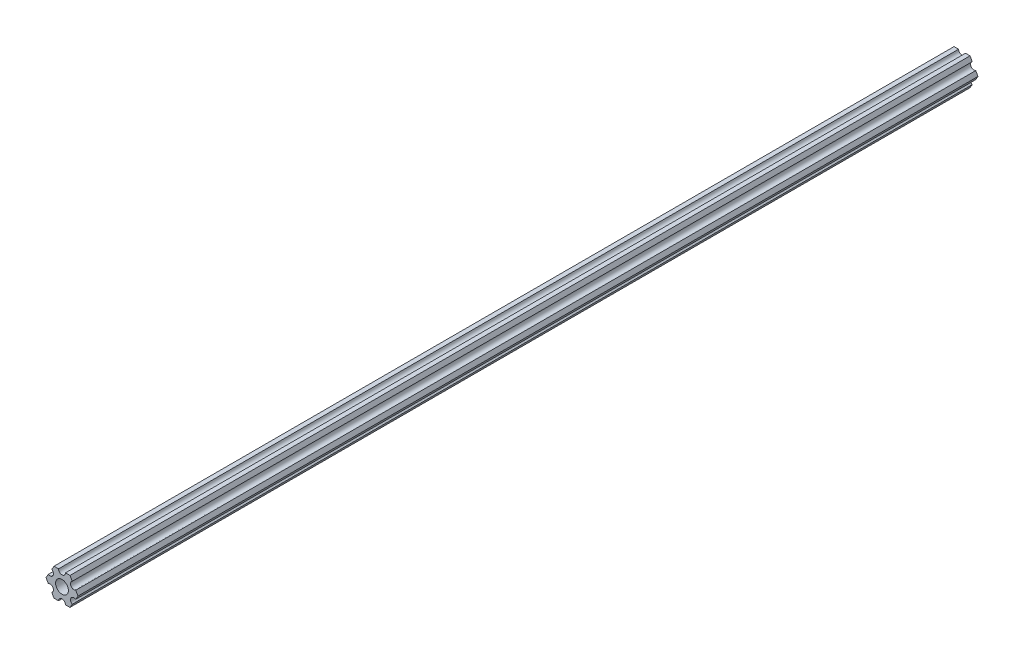
ISO-10303-21;
HEADER;
FILE_DESCRIPTION(('STEP AP214'),'2;1');
FILE_NAME('part.step','',(''),(''),'','','');
FILE_SCHEMA(('AUTOMOTIVE_DESIGN { 1 0 10303 214 1 1 1 1 }'));
ENDSEC;
DATA;
#1=APPLICATION_CONTEXT('core data for automotive mechanical design processes');
#2=APPLICATION_PROTOCOL_DEFINITION('international standard','automotive_design',2000,#1);
#3=PRODUCT_CONTEXT('',#1,'mechanical');
#4=PRODUCT('Part','Part','',(#3));
#5=PRODUCT_RELATED_PRODUCT_CATEGORY('part','',(#4));
#6=PRODUCT_DEFINITION_FORMATION('','',#4);
#7=PRODUCT_DEFINITION_CONTEXT('part definition',#1,'design');
#8=PRODUCT_DEFINITION('design','',#6,#7);
#9=PRODUCT_DEFINITION_SHAPE('','',#8);
#10=(LENGTH_UNIT() NAMED_UNIT(*) SI_UNIT(.MILLI.,.METRE.));
#11=(NAMED_UNIT(*) PLANE_ANGLE_UNIT() SI_UNIT($,.RADIAN.));
#12=(NAMED_UNIT(*) SI_UNIT($,.STERADIAN.) SOLID_ANGLE_UNIT());
#13=UNCERTAINTY_MEASURE_WITH_UNIT(LENGTH_MEASURE(1.E-05),#10,'distance_accuracy_value','');
#14=(GEOMETRIC_REPRESENTATION_CONTEXT(3) GLOBAL_UNCERTAINTY_ASSIGNED_CONTEXT((#13)) GLOBAL_UNIT_ASSIGNED_CONTEXT((#10,
#11,#12)) REPRESENTATION_CONTEXT('',''));
#15=CARTESIAN_POINT('',(0.,0.,0.));
#16=DIRECTION('',(0.,0.,1.));
#17=DIRECTION('',(1.,0.,0.));
#18=AXIS2_PLACEMENT_3D('',#15,#16,#17);
#19=CARTESIAN_POINT('',(5.49926112168156,3.17500033315933,412.75));
#20=DIRECTION('',(0.,0.,1.));
#21=DIRECTION('',(1.,0.,0.));
#22=AXIS2_PLACEMENT_3D('',#19,#20,#21);
#23=PLANE('',#22);
#24=DIRECTION('',(0.499999947533953,0.866025434075723,0.));
#25=VECTOR('',#24,1.);
#26=CARTESIAN_POINT('',(6.29301142309098,-1.80018429024546,412.75));
#27=LINE('',#26,#25);
#28=CARTESIAN_POINT('',(6.29301142309098,-1.80018429024546,412.75));
#29=VERTEX_POINT('',#28);
#30=CARTESIAN_POINT('',(7.33234841870826,4.44212519169686E-07,412.75));
#31=VERTEX_POINT('',#30);
#32=EDGE_CURVE('E228',#29,#31,#27,.T.);
#33=ORIENTED_EDGE('',*,*,#32,.T.);
#34=DIRECTION('',(-0.500000052466056,0.866025373493145,0.));
#35=VECTOR('',#34,1.);
#36=CARTESIAN_POINT('',(7.33234841870826,4.44212519169686E-07,412.75));
#37=LINE('',#36,#35);
#38=CARTESIAN_POINT('',(6.29301120497139,1.80018505273894,412.75));
#39=VERTEX_POINT('',#38);
#40=EDGE_CURVE('E126',#31,#39,#37,.T.);
#41=ORIENTED_EDGE('',*,*,#40,.T.);
#42=CARTESIAN_POINT('',(5.49926112168156,3.17500033315933,412.75));
#43=DIRECTION('',(0.,0.,-1.));
#44=DIRECTION('',(1.,0.,0.));
#45=AXIS2_PLACEMENT_3D('',#42,#43,#44);
#46=CIRCLE('',#45,1.5875);
#47=CARTESIAN_POINT('',(4.70551103839172,4.54981561357972,412.75));
#48=VERTEX_POINT('',#47);
#49=EDGE_CURVE('E273',#39,#48,#46,.T.);
#50=ORIENTED_EDGE('',*,*,#49,.T.);
#51=DIRECTION('',(-0.500000052466046,0.866025373493151,0.));
#52=VECTOR('',#51,1.);
#53=CARTESIAN_POINT('',(4.70551103839172,4.54981561357972,412.75));
#54=LINE('',#53,#52);
#55=CARTESIAN_POINT('',(3.66617382465481,6.35000022210627,412.75));
#56=VERTEX_POINT('',#55);
#57=EDGE_CURVE('E292',#48,#56,#54,.T.);
#58=ORIENTED_EDGE('',*,*,#57,.T.);
#59=DIRECTION('',(-0.999999999999998,-6.05825850611185E-08,0.));
#60=VECTOR('',#59,1.);
#61=CARTESIAN_POINT('',(3.66617382465481,6.35000022210627,412.75));
#62=LINE('',#61,#60);
#63=CARTESIAN_POINT('',(1.58749961530074,6.35000009617482,412.75));
#64=VERTEX_POINT('',#63);
#65=EDGE_CURVE('E289',#56,#64,#62,.T.);
#66=ORIENTED_EDGE('',*,*,#65,.T.);
#67=CARTESIAN_POINT('',(-3.84699260060323E-07,6.35,412.75));
#68=DIRECTION('',(0.,0.,-1.));
#69=DIRECTION('',(1.,0.,0.));
#70=AXIS2_PLACEMENT_3D('',#67,#68,#69);
#71=CIRCLE('',#70,1.5875);
#72=CARTESIAN_POINT('',(-1.58750038469926,6.34999990382518,412.75));
#73=VERTEX_POINT('',#72);
#74=EDGE_CURVE('E291',#64,#73,#71,.T.);
#75=ORIENTED_EDGE('',*,*,#74,.T.);
#76=DIRECTION('',(-0.999999999999998,-6.05825963273174E-08,0.));
#77=VECTOR('',#76,1.);
#78=CARTESIAN_POINT('',(-1.58750038469926,6.34999990382518,412.75));
#79=LINE('',#78,#77);
#80=CARTESIAN_POINT('',(-3.66617459405349,6.3499997778937,412.75));
#81=VERTEX_POINT('',#80);
#82=EDGE_CURVE('E294',#73,#81,#79,.T.);
#83=ORIENTED_EDGE('',*,*,#82,.T.);
#84=DIRECTION('',(-0.499999947533942,-0.866025434075729,0.));
#85=VECTOR('',#84,1.);
#86=CARTESIAN_POINT('',(-3.66617459405349,6.3499997778937,412.75));
#87=LINE('',#86,#85);
#88=CARTESIAN_POINT('',(-4.70551158967065,4.54981504343587,412.75));
#89=VERTEX_POINT('',#88);
#90=EDGE_CURVE('E300',#81,#89,#87,.T.);
#91=ORIENTED_EDGE('',*,*,#90,.T.);
#92=CARTESIAN_POINT('',(-5.49926150638082,3.17499966684067,412.75));
#93=DIRECTION('',(0.,0.,-1.));
#94=DIRECTION('',(1.,0.,0.));
#95=AXIS2_PLACEMENT_3D('',#92,#93,#94);
#96=CIRCLE('',#95,1.5875);
#97=CARTESIAN_POINT('',(-6.29301142309098,1.80018429024547,412.75));
#98=VERTEX_POINT('',#97);
#99=EDGE_CURVE('E302',#89,#98,#96,.T.);
#100=ORIENTED_EDGE('',*,*,#99,.T.);
#101=DIRECTION('',(-0.499999947533951,-0.866025434075724,0.));
#102=VECTOR('',#101,1.);
#103=CARTESIAN_POINT('',(-6.29301142309098,1.80018429024547,412.75));
#104=LINE('',#103,#102);
#105=CARTESIAN_POINT('',(-7.33234841870826,-4.44212523790841E-07,412.75));
#106=VERTEX_POINT('',#105);
#107=EDGE_CURVE('E304',#98,#106,#104,.T.);
#108=ORIENTED_EDGE('',*,*,#107,.T.);
#109=DIRECTION('',(0.500000052466045,-0.866025373493151,0.));
#110=VECTOR('',#109,1.);
#111=CARTESIAN_POINT('',(-7.33234841870826,-4.44212523790841E-07,412.75));
#112=LINE('',#111,#110);
#113=CARTESIAN_POINT('',(-6.29301120497141,-1.80018505273897,412.75));
#114=VERTEX_POINT('',#113);
#115=EDGE_CURVE('E306',#106,#114,#112,.T.);
#116=ORIENTED_EDGE('',*,*,#115,.T.);
#117=CARTESIAN_POINT('',(-5.49926112168156,-3.17500033315934,412.75));
#118=DIRECTION('',(0.,0.,-1.));
#119=DIRECTION('',(1.,0.,0.));
#120=AXIS2_PLACEMENT_3D('',#117,#118,#119);
#121=CIRCLE('',#120,1.5875);
#122=CARTESIAN_POINT('',(-4.70551103839172,-4.54981561357972,412.75));
#123=VERTEX_POINT('',#122);
#124=EDGE_CURVE('E308',#114,#123,#121,.T.);
#125=ORIENTED_EDGE('',*,*,#124,.T.);
#126=DIRECTION('',(0.500000052466045,-0.866025373493151,0.));
#127=VECTOR('',#126,1.);
#128=CARTESIAN_POINT('',(-4.70551103839172,-4.54981561357972,412.75));
#129=LINE('',#128,#127);
#130=CARTESIAN_POINT('',(-3.66617382465481,-6.35000022210628,412.75));
#131=VERTEX_POINT('',#130);
#132=EDGE_CURVE('E310',#123,#131,#129,.T.);
#133=ORIENTED_EDGE('',*,*,#132,.T.);
#134=DIRECTION('',(0.999999999999998,6.05825854783851E-08,0.));
#135=VECTOR('',#134,1.);
#136=CARTESIAN_POINT('',(-3.66617382465481,-6.35000022210628,412.75));
#137=LINE('',#136,#135);
#138=CARTESIAN_POINT('',(-1.58749961530074,-6.35000009617482,412.75));
#139=VERTEX_POINT('',#138);
#140=EDGE_CURVE('E312',#131,#139,#137,.T.);
#141=ORIENTED_EDGE('',*,*,#140,.T.);
#142=CARTESIAN_POINT('',(3.8469926204343E-07,-6.35,412.75));
#143=DIRECTION('',(0.,0.,-1.));
#144=DIRECTION('',(1.,0.,0.));
#145=AXIS2_PLACEMENT_3D('',#142,#143,#144);
#146=CIRCLE('',#145,1.5875);
#147=CARTESIAN_POINT('',(1.58750038469926,-6.34999990382518,412.75));
#148=VERTEX_POINT('',#147);
#149=EDGE_CURVE('E175',#139,#148,#146,.T.);
#150=ORIENTED_EDGE('',*,*,#149,.T.);
#151=DIRECTION('',(0.999999999999998,6.05825721258438E-08,0.));
#152=VECTOR('',#151,1.);
#153=CARTESIAN_POINT('',(1.58750038469926,-6.34999990382518,412.75));
#154=LINE('',#153,#152);
#155=CARTESIAN_POINT('',(3.66617459405346,-6.34999977789375,412.75));
#156=VERTEX_POINT('',#155);
#157=EDGE_CURVE('E169',#148,#156,#154,.T.);
#158=ORIENTED_EDGE('',*,*,#157,.T.);
#159=DIRECTION('',(0.499999947533941,0.86602543407573,0.));
#160=VECTOR('',#159,1.);
#161=CARTESIAN_POINT('',(3.66617459405346,-6.34999977789375,412.75));
#162=LINE('',#161,#160);
#163=CARTESIAN_POINT('',(4.70551158967065,-4.54981504343587,412.75));
#164=VERTEX_POINT('',#163);
#165=EDGE_CURVE('E173',#156,#164,#162,.T.);
#166=ORIENTED_EDGE('',*,*,#165,.T.);
#167=CARTESIAN_POINT('',(5.49926150638082,-3.17499966684067,412.75));
#168=DIRECTION('',(0.,0.,-1.));
#169=DIRECTION('',(1.,0.,0.));
#170=AXIS2_PLACEMENT_3D('',#167,#168,#169);
#171=CIRCLE('',#170,1.58750000000001);
#172=EDGE_CURVE('E53',#164,#29,#171,.T.);
#173=ORIENTED_EDGE('',*,*,#172,.T.);
#174=EDGE_LOOP('',(#33,#41,#50,#58,#66,#75,#83,#91,#100,#108,#116,#125,#133,#141,#150,#158,#166,#173));
#175=FACE_BOUND('',#174,.T.);
#176=CARTESIAN_POINT('',(0.,0.,412.75));
#177=DIRECTION('',(0.,0.,1.));
#178=DIRECTION('',(1.,0.,0.));
#179=AXIS2_PLACEMENT_3D('',#176,#177,#178);
#180=CIRCLE('',#179,2.9337);
#181=CARTESIAN_POINT('',(2.9337,0.,412.75));
#182=VERTEX_POINT('',#181);
#183=EDGE_CURVE('E197',#182,#182,#180,.T.);
#184=ORIENTED_EDGE('',*,*,#183,.F.);
#185=EDGE_LOOP('',(#184));
#186=FACE_BOUND('',#185,.T.);
#187=ADVANCED_FACE('F36',(#175,#186),#23,.T.);
#188=CARTESIAN_POINT('',(5.49926112168156,3.17500033315933,0.));
#189=DIRECTION('',(0.,0.,1.));
#190=DIRECTION('',(1.,0.,0.));
#191=AXIS2_PLACEMENT_3D('',#188,#189,#190);
#192=PLANE('',#191);
#193=DIRECTION('',(0.499999947533953,0.866025434075723,0.));
#194=VECTOR('',#193,1.);
#195=CARTESIAN_POINT('',(6.29301142309098,-1.80018429024546,0.));
#196=LINE('',#195,#194);
#197=CARTESIAN_POINT('',(6.29301142309098,-1.80018429024546,0.));
#198=VERTEX_POINT('',#197);
#199=CARTESIAN_POINT('',(7.33234841870826,4.44212519169686E-07,0.));
#200=VERTEX_POINT('',#199);
#201=EDGE_CURVE('E193',#198,#200,#196,.T.);
#202=ORIENTED_EDGE('',*,*,#201,.F.);
#203=CARTESIAN_POINT('',(5.49926150638082,-3.17499966684067,0.));
#204=DIRECTION('',(0.,0.,-1.));
#205=DIRECTION('',(1.,0.,0.));
#206=AXIS2_PLACEMENT_3D('',#203,#204,#205);
#207=CIRCLE('',#206,1.58750000000001);
#208=CARTESIAN_POINT('',(4.70551158967065,-4.54981504343587,0.));
#209=VERTEX_POINT('',#208);
#210=EDGE_CURVE('E118',#209,#198,#207,.T.);
#211=ORIENTED_EDGE('',*,*,#210,.F.);
#212=DIRECTION('',(0.499999947533941,0.86602543407573,0.));
#213=VECTOR('',#212,1.);
#214=CARTESIAN_POINT('',(3.66617459405346,-6.34999977789375,0.));
#215=LINE('',#214,#213);
#216=CARTESIAN_POINT('',(3.66617459405346,-6.34999977789375,0.));
#217=VERTEX_POINT('',#216);
#218=EDGE_CURVE('E112',#217,#209,#215,.T.);
#219=ORIENTED_EDGE('',*,*,#218,.F.);
#220=DIRECTION('',(0.999999999999998,6.05825721258438E-08,0.));
#221=VECTOR('',#220,1.);
#222=CARTESIAN_POINT('',(1.58750038469926,-6.34999990382518,0.));
#223=LINE('',#222,#221);
#224=CARTESIAN_POINT('',(1.58750038469926,-6.34999990382518,0.));
#225=VERTEX_POINT('',#224);
#226=EDGE_CURVE('E183',#225,#217,#223,.T.);
#227=ORIENTED_EDGE('',*,*,#226,.F.);
#228=CARTESIAN_POINT('',(3.8469926204343E-07,-6.35,0.));
#229=DIRECTION('',(0.,0.,-1.));
#230=DIRECTION('',(1.,0.,0.));
#231=AXIS2_PLACEMENT_3D('',#228,#229,#230);
#232=CIRCLE('',#231,1.5875);
#233=CARTESIAN_POINT('',(-1.58749961530074,-6.35000009617482,0.));
#234=VERTEX_POINT('',#233);
#235=EDGE_CURVE('E223',#234,#225,#232,.T.);
#236=ORIENTED_EDGE('',*,*,#235,.F.);
#237=DIRECTION('',(0.999999999999998,6.05825854783851E-08,0.));
#238=VECTOR('',#237,1.);
#239=CARTESIAN_POINT('',(-3.66617382465481,-6.35000022210628,0.));
#240=LINE('',#239,#238);
#241=CARTESIAN_POINT('',(-3.66617382465481,-6.35000022210628,0.));
#242=VERTEX_POINT('',#241);
#243=EDGE_CURVE('E221',#242,#234,#240,.T.);
#244=ORIENTED_EDGE('',*,*,#243,.F.);
#245=DIRECTION('',(0.500000052466045,-0.866025373493151,0.));
#246=VECTOR('',#245,1.);
#247=CARTESIAN_POINT('',(-4.70551103839172,-4.54981561357972,0.));
#248=LINE('',#247,#246);
#249=CARTESIAN_POINT('',(-4.70551103839172,-4.54981561357972,0.));
#250=VERTEX_POINT('',#249);
#251=EDGE_CURVE('E219',#250,#242,#248,.T.);
#252=ORIENTED_EDGE('',*,*,#251,.F.);
#253=CARTESIAN_POINT('',(-5.49926112168156,-3.17500033315934,0.));
#254=DIRECTION('',(0.,0.,-1.));
#255=DIRECTION('',(1.,0.,0.));
#256=AXIS2_PLACEMENT_3D('',#253,#254,#255);
#257=CIRCLE('',#256,1.5875);
#258=CARTESIAN_POINT('',(-6.29301120497141,-1.80018505273897,0.));
#259=VERTEX_POINT('',#258);
#260=EDGE_CURVE('E217',#259,#250,#257,.T.);
#261=ORIENTED_EDGE('',*,*,#260,.F.);
#262=DIRECTION('',(0.500000052466045,-0.866025373493151,0.));
#263=VECTOR('',#262,1.);
#264=CARTESIAN_POINT('',(-7.33234841870826,-4.44212523790841E-07,0.));
#265=LINE('',#264,#263);
#266=CARTESIAN_POINT('',(-7.33234841870826,-4.44212523790841E-07,0.));
#267=VERTEX_POINT('',#266);
#268=EDGE_CURVE('E215',#267,#259,#265,.T.);
#269=ORIENTED_EDGE('',*,*,#268,.F.);
#270=DIRECTION('',(-0.499999947533951,-0.866025434075724,0.));
#271=VECTOR('',#270,1.);
#272=CARTESIAN_POINT('',(-6.29301142309098,1.80018429024547,0.));
#273=LINE('',#272,#271);
#274=CARTESIAN_POINT('',(-6.29301142309098,1.80018429024547,0.));
#275=VERTEX_POINT('',#274);
#276=EDGE_CURVE('E213',#275,#267,#273,.T.);
#277=ORIENTED_EDGE('',*,*,#276,.F.);
#278=CARTESIAN_POINT('',(-5.49926150638082,3.17499966684067,0.));
#279=DIRECTION('',(0.,0.,-1.));
#280=DIRECTION('',(1.,0.,0.));
#281=AXIS2_PLACEMENT_3D('',#278,#279,#280);
#282=CIRCLE('',#281,1.5875);
#283=CARTESIAN_POINT('',(-4.70551158967065,4.54981504343587,0.));
#284=VERTEX_POINT('',#283);
#285=EDGE_CURVE('E211',#284,#275,#282,.T.);
#286=ORIENTED_EDGE('',*,*,#285,.F.);
#287=DIRECTION('',(-0.499999947533942,-0.866025434075729,0.));
#288=VECTOR('',#287,1.);
#289=CARTESIAN_POINT('',(-3.66617459405349,6.3499997778937,0.));
#290=LINE('',#289,#288);
#291=CARTESIAN_POINT('',(-3.66617459405349,6.3499997778937,0.));
#292=VERTEX_POINT('',#291);
#293=EDGE_CURVE('E209',#292,#284,#290,.T.);
#294=ORIENTED_EDGE('',*,*,#293,.F.);
#295=DIRECTION('',(-0.999999999999998,-6.05825963273174E-08,0.));
#296=VECTOR('',#295,1.);
#297=CARTESIAN_POINT('',(-1.58750038469926,6.34999990382518,0.));
#298=LINE('',#297,#296);
#299=CARTESIAN_POINT('',(-1.58750038469926,6.34999990382518,0.));
#300=VERTEX_POINT('',#299);
#301=EDGE_CURVE('E207',#300,#292,#298,.T.);
#302=ORIENTED_EDGE('',*,*,#301,.F.);
#303=CARTESIAN_POINT('',(-3.84699260060323E-07,6.35,0.));
#304=DIRECTION('',(0.,0.,-1.));
#305=DIRECTION('',(1.,0.,0.));
#306=AXIS2_PLACEMENT_3D('',#303,#304,#305);
#307=CIRCLE('',#306,1.5875);
#308=CARTESIAN_POINT('',(1.58749961530074,6.35000009617482,0.));
#309=VERTEX_POINT('',#308);
#310=EDGE_CURVE('E205',#309,#300,#307,.T.);
#311=ORIENTED_EDGE('',*,*,#310,.F.);
#312=DIRECTION('',(-0.999999999999998,-6.05825850611185E-08,0.));
#313=VECTOR('',#312,1.);
#314=CARTESIAN_POINT('',(3.66617382465481,6.35000022210627,0.));
#315=LINE('',#314,#313);
#316=CARTESIAN_POINT('',(3.66617382465481,6.35000022210627,0.));
#317=VERTEX_POINT('',#316);
#318=EDGE_CURVE('E203',#317,#309,#315,.T.);
#319=ORIENTED_EDGE('',*,*,#318,.F.);
#320=DIRECTION('',(-0.500000052466046,0.866025373493151,0.));
#321=VECTOR('',#320,1.);
#322=CARTESIAN_POINT('',(4.70551103839172,4.54981561357972,0.));
#323=LINE('',#322,#321);
#324=CARTESIAN_POINT('',(4.70551103839172,4.54981561357972,0.));
#325=VERTEX_POINT('',#324);
#326=EDGE_CURVE('E201',#325,#317,#323,.T.);
#327=ORIENTED_EDGE('',*,*,#326,.F.);
#328=CARTESIAN_POINT('',(5.49926112168156,3.17500033315933,0.));
#329=DIRECTION('',(0.,0.,-1.));
#330=DIRECTION('',(1.,0.,0.));
#331=AXIS2_PLACEMENT_3D('',#328,#329,#330);
#332=CIRCLE('',#331,1.5875);
#333=CARTESIAN_POINT('',(6.29301120497139,1.80018505273894,0.));
#334=VERTEX_POINT('',#333);
#335=EDGE_CURVE('E199',#334,#325,#332,.T.);
#336=ORIENTED_EDGE('',*,*,#335,.F.);
#337=DIRECTION('',(-0.500000052466056,0.866025373493145,0.));
#338=VECTOR('',#337,1.);
#339=CARTESIAN_POINT('',(7.33234841870826,4.44212519169686E-07,0.));
#340=LINE('',#339,#338);
#341=EDGE_CURVE('E196',#200,#334,#340,.T.);
#342=ORIENTED_EDGE('',*,*,#341,.F.);
#343=EDGE_LOOP('',(#202,#211,#219,#227,#236,#244,#252,#261,#269,#277,#286,#294,#302,#311,#319,
#327,#336,#342));
#344=FACE_BOUND('',#343,.T.);
#345=CARTESIAN_POINT('',(0.,0.,0.));
#346=DIRECTION('',(0.,0.,1.));
#347=DIRECTION('',(1.,0.,0.));
#348=AXIS2_PLACEMENT_3D('',#345,#346,#347);
#349=CIRCLE('',#348,2.9337);
#350=CARTESIAN_POINT('',(2.9337,0.,0.));
#351=VERTEX_POINT('',#350);
#352=EDGE_CURVE('E537',#351,#351,#349,.T.);
#353=ORIENTED_EDGE('',*,*,#352,.T.);
#354=EDGE_LOOP('',(#353));
#355=FACE_BOUND('',#354,.T.);
#356=ADVANCED_FACE('F277',(#344,#355),#192,.F.);
#357=CARTESIAN_POINT('',(6.29301142309098,-1.80018429024546,412.75));
#358=DIRECTION('',(-0.866025434075723,0.499999947533953,0.));
#359=DIRECTION('',(-0.499999947533953,-0.866025434075723,0.));
#360=AXIS2_PLACEMENT_3D('',#357,#358,#359);
#361=PLANE('',#360);
#362=ORIENTED_EDGE('',*,*,#201,.T.);
#363=DIRECTION('',(0.,0.,-1.));
#364=VECTOR('',#363,1.);
#365=CARTESIAN_POINT('',(7.33234841870826,4.44212519169686E-07,412.75));
#366=LINE('',#365,#364);
#367=EDGE_CURVE('E11',#31,#200,#366,.T.);
#368=ORIENTED_EDGE('',*,*,#367,.F.);
#369=ORIENTED_EDGE('',*,*,#32,.F.);
#370=DIRECTION('',(0.,0.,-1.));
#371=VECTOR('',#370,1.);
#372=CARTESIAN_POINT('',(6.29301142309098,-1.80018429024546,412.75));
#373=LINE('',#372,#371);
#374=EDGE_CURVE('E189',#29,#198,#373,.T.);
#375=ORIENTED_EDGE('',*,*,#374,.T.);
#376=EDGE_LOOP('',(#362,#368,#369,#375));
#377=FACE_BOUND('',#376,.T.);
#378=ADVANCED_FACE('F38',(#377),#361,.F.);
#379=CARTESIAN_POINT('',(7.33234841870826,4.44212519169686E-07,412.75));
#380=DIRECTION('',(-0.866025373493145,-0.500000052466056,0.));
#381=DIRECTION('',(0.500000052466056,-0.866025373493145,0.));
#382=AXIS2_PLACEMENT_3D('',#379,#380,#381);
#383=PLANE('',#382);
#384=ORIENTED_EDGE('',*,*,#341,.T.);
#385=DIRECTION('',(0.,0.,-1.));
#386=VECTOR('',#385,1.);
#387=CARTESIAN_POINT('',(6.29301120497139,1.80018505273894,412.75));
#388=LINE('',#387,#386);
#389=EDGE_CURVE('E45',#39,#334,#388,.T.);
#390=ORIENTED_EDGE('',*,*,#389,.F.);
#391=ORIENTED_EDGE('',*,*,#40,.F.);
#392=ORIENTED_EDGE('',*,*,#367,.T.);
#393=EDGE_LOOP('',(#384,#390,#391,#392));
#394=FACE_BOUND('',#393,.T.);
#395=ADVANCED_FACE('F346',(#394),#383,.F.);
#396=CARTESIAN_POINT('',(5.49926112168156,3.17500033315933,412.75));
#397=DIRECTION('',(0.,0.,-1.));
#398=DIRECTION('',(-1.,0.,0.));
#399=AXIS2_PLACEMENT_3D('',#396,#397,#398);
#400=CYLINDRICAL_SURFACE('',#399,1.5875);
#401=ORIENTED_EDGE('',*,*,#335,.T.);
#402=DIRECTION('',(0.,0.,-1.));
#403=VECTOR('',#402,1.);
#404=CARTESIAN_POINT('',(4.70551103839172,4.54981561357972,412.75));
#405=LINE('',#404,#403);
#406=EDGE_CURVE('E265',#48,#325,#405,.T.);
#407=ORIENTED_EDGE('',*,*,#406,.F.);
#408=ORIENTED_EDGE('',*,*,#49,.F.);
#409=ORIENTED_EDGE('',*,*,#389,.T.);
#410=EDGE_LOOP('',(#401,#407,#408,#409));
#411=FACE_BOUND('',#410,.T.);
#412=ADVANCED_FACE('F271',(#411),#400,.F.);
#413=CARTESIAN_POINT('',(4.70551103839172,4.54981561357972,412.75));
#414=DIRECTION('',(-0.866025373493151,-0.500000052466046,0.));
#415=DIRECTION('',(0.500000052466046,-0.866025373493151,0.));
#416=AXIS2_PLACEMENT_3D('',#413,#414,#415);
#417=PLANE('',#416);
#418=ORIENTED_EDGE('',*,*,#326,.T.);
#419=DIRECTION('',(0.,0.,-1.));
#420=VECTOR('',#419,1.);
#421=CARTESIAN_POINT('',(3.66617382465481,6.35000022210627,412.75));
#422=LINE('',#421,#420);
#423=EDGE_CURVE('E262',#56,#317,#422,.T.);
#424=ORIENTED_EDGE('',*,*,#423,.F.);
#425=ORIENTED_EDGE('',*,*,#57,.F.);
#426=ORIENTED_EDGE('',*,*,#406,.T.);
#427=EDGE_LOOP('',(#418,#424,#425,#426));
#428=FACE_BOUND('',#427,.T.);
#429=ADVANCED_FACE('F283',(#428),#417,.F.);
#430=CARTESIAN_POINT('',(3.66617382465481,6.35000022210627,412.75));
#431=DIRECTION('',(6.05825850611185E-08,-0.999999999999998,0.));
#432=DIRECTION('',(0.999999999999998,6.05825850611185E-08,0.));
#433=AXIS2_PLACEMENT_3D('',#430,#431,#432);
#434=PLANE('',#433);
#435=ORIENTED_EDGE('',*,*,#318,.T.);
#436=DIRECTION('',(0.,0.,-1.));
#437=VECTOR('',#436,1.);
#438=CARTESIAN_POINT('',(1.58749961530074,6.35000009617482,412.75));
#439=LINE('',#438,#437);
#440=EDGE_CURVE('E259',#64,#309,#439,.T.);
#441=ORIENTED_EDGE('',*,*,#440,.F.);
#442=ORIENTED_EDGE('',*,*,#65,.F.);
#443=ORIENTED_EDGE('',*,*,#423,.T.);
#444=EDGE_LOOP('',(#435,#441,#442,#443));
#445=FACE_BOUND('',#444,.T.);
#446=ADVANCED_FACE('F287',(#445),#434,.F.);
#447=CARTESIAN_POINT('',(-3.84699260060323E-07,6.35,412.75));
#448=DIRECTION('',(0.,0.,-1.));
#449=DIRECTION('',(-1.,0.,0.));
#450=AXIS2_PLACEMENT_3D('',#447,#448,#449);
#451=CYLINDRICAL_SURFACE('',#450,1.5875);
#452=ORIENTED_EDGE('',*,*,#310,.T.);
#453=DIRECTION('',(0.,0.,-1.));
#454=VECTOR('',#453,1.);
#455=CARTESIAN_POINT('',(-1.58750038469926,6.34999990382518,412.75));
#456=LINE('',#455,#454);
#457=EDGE_CURVE('E256',#73,#300,#456,.T.);
#458=ORIENTED_EDGE('',*,*,#457,.F.);
#459=ORIENTED_EDGE('',*,*,#74,.F.);
#460=ORIENTED_EDGE('',*,*,#440,.T.);
#461=EDGE_LOOP('',(#452,#458,#459,#460));
#462=FACE_BOUND('',#461,.T.);
#463=ADVANCED_FACE('F359',(#462),#451,.F.);
#464=CARTESIAN_POINT('',(-1.58750038469926,6.34999990382518,412.75));
#465=DIRECTION('',(6.05825963273174E-08,-0.999999999999998,0.));
#466=DIRECTION('',(0.999999999999998,6.05825963273174E-08,0.));
#467=AXIS2_PLACEMENT_3D('',#464,#465,#466);
#468=PLANE('',#467);
#469=ORIENTED_EDGE('',*,*,#301,.T.);
#470=DIRECTION('',(0.,0.,-1.));
#471=VECTOR('',#470,1.);
#472=CARTESIAN_POINT('',(-3.66617459405349,6.3499997778937,412.75));
#473=LINE('',#472,#471);
#474=EDGE_CURVE('E253',#81,#292,#473,.T.);
#475=ORIENTED_EDGE('',*,*,#474,.F.);
#476=ORIENTED_EDGE('',*,*,#82,.F.);
#477=ORIENTED_EDGE('',*,*,#457,.T.);
#478=EDGE_LOOP('',(#469,#475,#476,#477));
#479=FACE_BOUND('',#478,.T.);
#480=ADVANCED_FACE('F362',(#479),#468,.F.);
#481=CARTESIAN_POINT('',(-3.66617459405349,6.3499997778937,412.75));
#482=DIRECTION('',(0.866025434075729,-0.499999947533942,0.));
#483=DIRECTION('',(0.499999947533943,0.866025434075729,0.));
#484=AXIS2_PLACEMENT_3D('',#481,#482,#483);
#485=PLANE('',#484);
#486=ORIENTED_EDGE('',*,*,#293,.T.);
#487=DIRECTION('',(0.,0.,-1.));
#488=VECTOR('',#487,1.);
#489=CARTESIAN_POINT('',(-4.70551158967065,4.54981504343587,412.75));
#490=LINE('',#489,#488);
#491=EDGE_CURVE('E250',#89,#284,#490,.T.);
#492=ORIENTED_EDGE('',*,*,#491,.F.);
#493=ORIENTED_EDGE('',*,*,#90,.F.);
#494=ORIENTED_EDGE('',*,*,#474,.T.);
#495=EDGE_LOOP('',(#486,#492,#493,#494));
#496=FACE_BOUND('',#495,.T.);
#497=ADVANCED_FACE('F366',(#496),#485,.F.);
#498=CARTESIAN_POINT('',(-5.49926150638082,3.17499966684067,412.75));
#499=DIRECTION('',(0.,0.,-1.));
#500=DIRECTION('',(-1.,0.,0.));
#501=AXIS2_PLACEMENT_3D('',#498,#499,#500);
#502=CYLINDRICAL_SURFACE('',#501,1.5875);
#503=ORIENTED_EDGE('',*,*,#285,.T.);
#504=DIRECTION('',(0.,0.,-1.));
#505=VECTOR('',#504,1.);
#506=CARTESIAN_POINT('',(-6.29301142309098,1.80018429024547,412.75));
#507=LINE('',#506,#505);
#508=EDGE_CURVE('E247',#98,#275,#507,.T.);
#509=ORIENTED_EDGE('',*,*,#508,.F.);
#510=ORIENTED_EDGE('',*,*,#99,.F.);
#511=ORIENTED_EDGE('',*,*,#491,.T.);
#512=EDGE_LOOP('',(#503,#509,#510,#511));
#513=FACE_BOUND('',#512,.T.);
#514=ADVANCED_FACE('F370',(#513),#502,.F.);
#515=CARTESIAN_POINT('',(-6.29301142309098,1.80018429024547,412.75));
#516=DIRECTION('',(0.866025434075724,-0.499999947533951,0.));
#517=DIRECTION('',(0.499999947533951,0.866025434075724,0.));
#518=AXIS2_PLACEMENT_3D('',#515,#516,#517);
#519=PLANE('',#518);
#520=ORIENTED_EDGE('',*,*,#276,.T.);
#521=DIRECTION('',(0.,0.,-1.));
#522=VECTOR('',#521,1.);
#523=CARTESIAN_POINT('',(-7.33234841870826,-4.44212523790841E-07,412.75));
#524=LINE('',#523,#522);
#525=EDGE_CURVE('E244',#106,#267,#524,.T.);
#526=ORIENTED_EDGE('',*,*,#525,.F.);
#527=ORIENTED_EDGE('',*,*,#107,.F.);
#528=ORIENTED_EDGE('',*,*,#508,.T.);
#529=EDGE_LOOP('',(#520,#526,#527,#528));
#530=FACE_BOUND('',#529,.T.);
#531=ADVANCED_FACE('F374',(#530),#519,.F.);
#532=CARTESIAN_POINT('',(-7.33234841870826,-4.44212523790841E-07,412.75));
#533=DIRECTION('',(0.866025373493151,0.500000052466045,0.));
#534=DIRECTION('',(-0.500000052466045,0.866025373493151,0.));
#535=AXIS2_PLACEMENT_3D('',#532,#533,#534);
#536=PLANE('',#535);
#537=ORIENTED_EDGE('',*,*,#268,.T.);
#538=DIRECTION('',(0.,0.,-1.));
#539=VECTOR('',#538,1.);
#540=CARTESIAN_POINT('',(-6.29301120497141,-1.80018505273897,412.75));
#541=LINE('',#540,#539);
#542=EDGE_CURVE('E241',#114,#259,#541,.T.);
#543=ORIENTED_EDGE('',*,*,#542,.F.);
#544=ORIENTED_EDGE('',*,*,#115,.F.);
#545=ORIENTED_EDGE('',*,*,#525,.T.);
#546=EDGE_LOOP('',(#537,#543,#544,#545));
#547=FACE_BOUND('',#546,.T.);
#548=ADVANCED_FACE('F378',(#547),#536,.F.);
#549=CARTESIAN_POINT('',(-5.49926112168156,-3.17500033315934,412.75));
#550=DIRECTION('',(0.,0.,-1.));
#551=DIRECTION('',(-1.,0.,0.));
#552=AXIS2_PLACEMENT_3D('',#549,#550,#551);
#553=CYLINDRICAL_SURFACE('',#552,1.5875);
#554=ORIENTED_EDGE('',*,*,#260,.T.);
#555=DIRECTION('',(0.,0.,-1.));
#556=VECTOR('',#555,1.);
#557=CARTESIAN_POINT('',(-4.70551103839172,-4.54981561357972,412.75));
#558=LINE('',#557,#556);
#559=EDGE_CURVE('E238',#123,#250,#558,.T.);
#560=ORIENTED_EDGE('',*,*,#559,.F.);
#561=ORIENTED_EDGE('',*,*,#124,.F.);
#562=ORIENTED_EDGE('',*,*,#542,.T.);
#563=EDGE_LOOP('',(#554,#560,#561,#562));
#564=FACE_BOUND('',#563,.T.);
#565=ADVANCED_FACE('F382',(#564),#553,.F.);
#566=CARTESIAN_POINT('',(-4.70551103839172,-4.54981561357972,412.75));
#567=DIRECTION('',(0.866025373493151,0.500000052466045,0.));
#568=DIRECTION('',(-0.500000052466045,0.866025373493152,0.));
#569=AXIS2_PLACEMENT_3D('',#566,#567,#568);
#570=PLANE('',#569);
#571=ORIENTED_EDGE('',*,*,#251,.T.);
#572=DIRECTION('',(0.,0.,-1.));
#573=VECTOR('',#572,1.);
#574=CARTESIAN_POINT('',(-3.66617382465481,-6.35000022210628,412.75));
#575=LINE('',#574,#573);
#576=EDGE_CURVE('E235',#131,#242,#575,.T.);
#577=ORIENTED_EDGE('',*,*,#576,.F.);
#578=ORIENTED_EDGE('',*,*,#132,.F.);
#579=ORIENTED_EDGE('',*,*,#559,.T.);
#580=EDGE_LOOP('',(#571,#577,#578,#579));
#581=FACE_BOUND('',#580,.T.);
#582=ADVANCED_FACE('F386',(#581),#570,.F.);
#583=CARTESIAN_POINT('',(-3.66617382465481,-6.35000022210628,412.75));
#584=DIRECTION('',(-6.05825854783851E-08,0.999999999999998,0.));
#585=DIRECTION('',(-0.999999999999998,-6.05825854783851E-08,0.));
#586=AXIS2_PLACEMENT_3D('',#583,#584,#585);
#587=PLANE('',#586);
#588=ORIENTED_EDGE('',*,*,#243,.T.);
#589=DIRECTION('',(0.,0.,-1.));
#590=VECTOR('',#589,1.);
#591=CARTESIAN_POINT('',(-1.58749961530074,-6.35000009617482,412.75));
#592=LINE('',#591,#590);
#593=EDGE_CURVE('E232',#139,#234,#592,.T.);
#594=ORIENTED_EDGE('',*,*,#593,.F.);
#595=ORIENTED_EDGE('',*,*,#140,.F.);
#596=ORIENTED_EDGE('',*,*,#576,.T.);
#597=EDGE_LOOP('',(#588,#594,#595,#596));
#598=FACE_BOUND('',#597,.T.);
#599=ADVANCED_FACE('F318',(#598),#587,.F.);
#600=CARTESIAN_POINT('',(3.8469926204343E-07,-6.35,412.75));
#601=DIRECTION('',(0.,0.,-1.));
#602=DIRECTION('',(-1.,0.,0.));
#603=AXIS2_PLACEMENT_3D('',#600,#601,#602);
#604=CYLINDRICAL_SURFACE('',#603,1.5875);
#605=ORIENTED_EDGE('',*,*,#235,.T.);
#606=DIRECTION('',(0.,0.,-1.));
#607=VECTOR('',#606,1.);
#608=CARTESIAN_POINT('',(1.58750038469926,-6.34999990382518,412.75));
#609=LINE('',#608,#607);
#610=EDGE_CURVE('E184',#148,#225,#609,.T.);
#611=ORIENTED_EDGE('',*,*,#610,.F.);
#612=ORIENTED_EDGE('',*,*,#149,.F.);
#613=ORIENTED_EDGE('',*,*,#593,.T.);
#614=EDGE_LOOP('',(#605,#611,#612,#613));
#615=FACE_BOUND('',#614,.T.);
#616=ADVANCED_FACE('F322',(#615),#604,.F.);
#617=CARTESIAN_POINT('',(1.58750038469926,-6.34999990382518,412.75));
#618=DIRECTION('',(-6.05825721258438E-08,0.999999999999998,0.));
#619=DIRECTION('',(-0.999999999999998,-6.05825721258438E-08,0.));
#620=AXIS2_PLACEMENT_3D('',#617,#618,#619);
#621=PLANE('',#620);
#622=ORIENTED_EDGE('',*,*,#226,.T.);
#623=DIRECTION('',(0.,0.,-1.));
#624=VECTOR('',#623,1.);
#625=CARTESIAN_POINT('',(3.66617459405346,-6.34999977789375,412.75));
#626=LINE('',#625,#624);
#627=EDGE_CURVE('E180',#156,#217,#626,.T.);
#628=ORIENTED_EDGE('',*,*,#627,.F.);
#629=ORIENTED_EDGE('',*,*,#157,.F.);
#630=ORIENTED_EDGE('',*,*,#610,.T.);
#631=EDGE_LOOP('',(#622,#628,#629,#630));
#632=FACE_BOUND('',#631,.T.);
#633=ADVANCED_FACE('F181',(#632),#621,.F.);
#634=CARTESIAN_POINT('',(3.66617459405346,-6.34999977789375,412.75));
#635=DIRECTION('',(-0.86602543407573,0.499999947533941,0.));
#636=DIRECTION('',(-0.499999947533941,-0.86602543407573,0.));
#637=AXIS2_PLACEMENT_3D('',#634,#635,#636);
#638=PLANE('',#637);
#639=ORIENTED_EDGE('',*,*,#218,.T.);
#640=DIRECTION('',(0.,0.,-1.));
#641=VECTOR('',#640,1.);
#642=CARTESIAN_POINT('',(4.70551158967065,-4.54981504343587,412.75));
#643=LINE('',#642,#641);
#644=EDGE_CURVE('E185',#164,#209,#643,.T.);
#645=ORIENTED_EDGE('',*,*,#644,.F.);
#646=ORIENTED_EDGE('',*,*,#165,.F.);
#647=ORIENTED_EDGE('',*,*,#627,.T.);
#648=EDGE_LOOP('',(#639,#645,#646,#647));
#649=FACE_BOUND('',#648,.T.);
#650=ADVANCED_FACE('F187',(#649),#638,.F.);
#651=CARTESIAN_POINT('',(5.49926150638082,-3.17499966684067,412.75));
#652=DIRECTION('',(0.,0.,-1.));
#653=DIRECTION('',(-1.,0.,0.));
#654=AXIS2_PLACEMENT_3D('',#651,#652,#653);
#655=CYLINDRICAL_SURFACE('',#654,1.58750000000001);
#656=ORIENTED_EDGE('',*,*,#210,.T.);
#657=ORIENTED_EDGE('',*,*,#374,.F.);
#658=ORIENTED_EDGE('',*,*,#172,.F.);
#659=ORIENTED_EDGE('',*,*,#644,.T.);
#660=EDGE_LOOP('',(#656,#657,#658,#659));
#661=FACE_BOUND('',#660,.T.);
#662=ADVANCED_FACE('F326',(#661),#655,.F.);
#663=CARTESIAN_POINT('',(0.,0.,412.75));
#664=DIRECTION('',(0.,0.,-1.));
#665=DIRECTION('',(-1.,0.,0.));
#666=AXIS2_PLACEMENT_3D('',#663,#664,#665);
#667=CYLINDRICAL_SURFACE('',#666,2.9337);
#668=ORIENTED_EDGE('',*,*,#183,.T.);
#669=EDGE_LOOP('',(#668));
#670=FACE_BOUND('',#669,.T.);
#671=ORIENTED_EDGE('',*,*,#352,.F.);
#672=EDGE_LOOP('',(#671));
#673=FACE_BOUND('',#672,.T.);
#674=ADVANCED_FACE('F328',(#670,#673),#667,.F.);
#675=CLOSED_SHELL('',(#187,#356,#378,#395,#412,#429,#446,#463,#480,#497,#514,#531,#548,#565,
#582,#599,#616,#633,#650,#662,#674));
#676=MANIFOLD_SOLID_BREP('B2',#675);
#677=ADVANCED_BREP_SHAPE_REPRESENTATION('',(#18,#676),#14);
#678=SHAPE_DEFINITION_REPRESENTATION(#9,#677);
ENDSEC;
END-ISO-10303-21;
